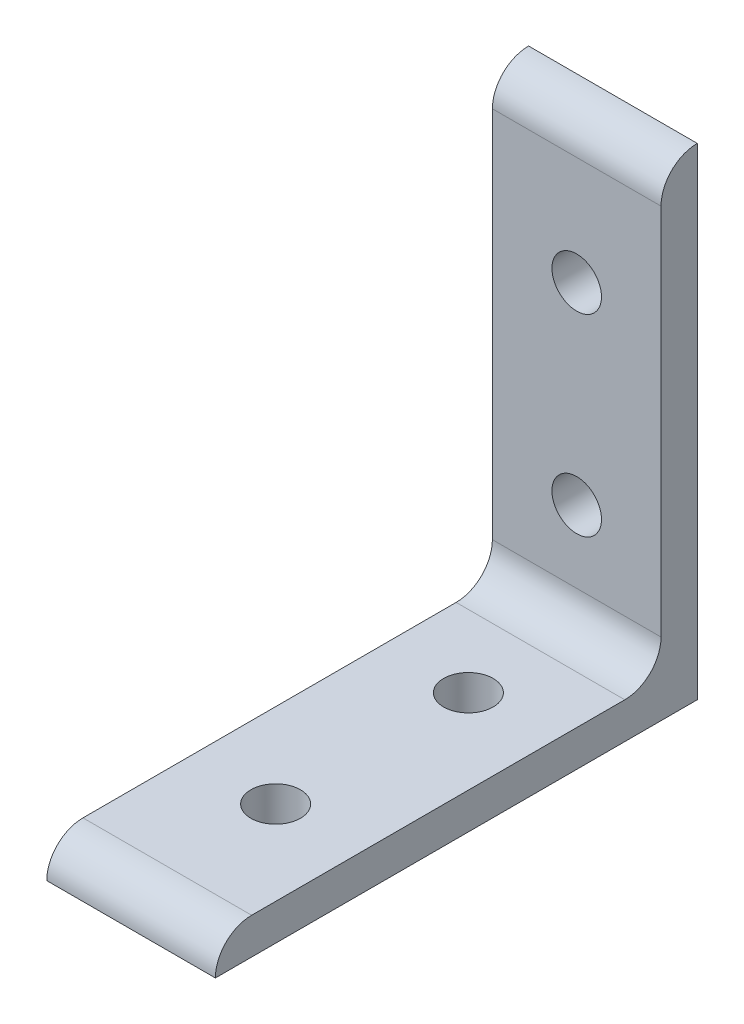
ISO-10303-21;
HEADER;
FILE_DESCRIPTION(('STEP AP214'),'2;1');
FILE_NAME('part.step','',(''),(''),'','','');
FILE_SCHEMA(('AUTOMOTIVE_DESIGN { 1 0 10303 214 1 1 1 1 }'));
ENDSEC;
DATA;
#1=APPLICATION_CONTEXT('core data for automotive mechanical design processes');
#2=APPLICATION_PROTOCOL_DEFINITION('international standard','automotive_design',2000,#1);
#3=PRODUCT_CONTEXT('',#1,'mechanical');
#4=PRODUCT('Part','Part','',(#3));
#5=PRODUCT_RELATED_PRODUCT_CATEGORY('part','',(#4));
#6=PRODUCT_DEFINITION_FORMATION('','',#4);
#7=PRODUCT_DEFINITION_CONTEXT('part definition',#1,'design');
#8=PRODUCT_DEFINITION('design','',#6,#7);
#9=PRODUCT_DEFINITION_SHAPE('','',#8);
#10=(LENGTH_UNIT() NAMED_UNIT(*) SI_UNIT(.MILLI.,.METRE.));
#11=(NAMED_UNIT(*) PLANE_ANGLE_UNIT() SI_UNIT($,.RADIAN.));
#12=(NAMED_UNIT(*) SI_UNIT($,.STERADIAN.) SOLID_ANGLE_UNIT());
#13=UNCERTAINTY_MEASURE_WITH_UNIT(LENGTH_MEASURE(1.E-05),#10,'distance_accuracy_value','');
#14=(GEOMETRIC_REPRESENTATION_CONTEXT(3) GLOBAL_UNCERTAINTY_ASSIGNED_CONTEXT((#13)) GLOBAL_UNIT_ASSIGNED_CONTEXT((#10,
#11,#12)) REPRESENTATION_CONTEXT('',''));
#15=CARTESIAN_POINT('',(0.,0.,0.));
#16=DIRECTION('',(0.,0.,1.));
#17=DIRECTION('',(1.,0.,0.));
#18=AXIS2_PLACEMENT_3D('',#15,#16,#17);
#19=CARTESIAN_POINT('',(0.,-29.6060903168951,34.7540413800445));
#20=DIRECTION('',(1.,0.,0.));
#21=DIRECTION('',(0.,0.,-1.));
#22=AXIS2_PLACEMENT_3D('',#19,#20,#21);
#23=CYLINDRICAL_SURFACE('',#22,4.7752);
#24=CARTESIAN_POINT('',(22.225,-29.6060903168951,34.7540413800445));
#25=DIRECTION('',(1.,0.,0.));
#26=DIRECTION('',(0.,0.,-1.));
#27=AXIS2_PLACEMENT_3D('',#24,#25,#26);
#28=CIRCLE('',#27,4.7752);
#29=CARTESIAN_POINT('',(22.225,-24.8308903168951,34.7540413800445));
#30=VERTEX_POINT('',#29);
#31=CARTESIAN_POINT('',(22.225,-29.6060903168951,39.5292413800445));
#32=VERTEX_POINT('',#31);
#33=EDGE_CURVE('E130',#30,#32,#28,.T.);
#34=ORIENTED_EDGE('',*,*,#33,.F.);
#35=DIRECTION('',(1.,0.,0.));
#36=VECTOR('',#35,1.);
#37=CARTESIAN_POINT('',(0.,-24.8308903168951,34.7540413800445));
#38=LINE('',#37,#36);
#39=CARTESIAN_POINT('',(0.,-24.8308903168951,34.7540413800445));
#40=VERTEX_POINT('',#39);
#41=EDGE_CURVE('E113',#40,#30,#38,.T.);
#42=ORIENTED_EDGE('',*,*,#41,.F.);
#43=CARTESIAN_POINT('',(0.,-29.6060903168951,34.7540413800445));
#44=DIRECTION('',(1.,0.,0.));
#45=DIRECTION('',(0.,0.,-1.));
#46=AXIS2_PLACEMENT_3D('',#43,#44,#45);
#47=CIRCLE('',#46,4.7752);
#48=CARTESIAN_POINT('',(0.,-29.6060903168951,39.5292413800445));
#49=VERTEX_POINT('',#48);
#50=EDGE_CURVE('E106',#40,#49,#47,.T.);
#51=ORIENTED_EDGE('',*,*,#50,.T.);
#52=DIRECTION('',(1.,0.,0.));
#53=VECTOR('',#52,1.);
#54=CARTESIAN_POINT('',(0.,-29.6060903168951,39.5292413800445));
#55=LINE('',#54,#53);
#56=EDGE_CURVE('E89',#49,#32,#55,.T.);
#57=ORIENTED_EDGE('',*,*,#56,.T.);
#58=EDGE_LOOP('',(#34,#42,#51,#57));
#59=FACE_BOUND('',#58,.T.);
#60=ADVANCED_FACE('F32',(#59),#23,.T.);
#61=CARTESIAN_POINT('',(0.,-24.8308903168951,-19.1955586199554));
#62=DIRECTION('',(0.,1.,0.));
#63=DIRECTION('',(0.,0.,1.));
#64=AXIS2_PLACEMENT_3D('',#61,#62,#63);
#65=PLANE('',#64);
#66=CARTESIAN_POINT('',(11.1125,-24.8308903168951,20.4792413800445));
#67=DIRECTION('',(0.,1.,0.));
#68=DIRECTION('',(0.,0.,1.));
#69=AXIS2_PLACEMENT_3D('',#66,#67,#68);
#70=CIRCLE('',#69,3.26390000000001);
#71=CARTESIAN_POINT('',(11.1125,-24.8308903168951,23.7431413800445));
#72=VERTEX_POINT('',#71);
#73=EDGE_CURVE('E213',#72,#72,#70,.T.);
#74=ORIENTED_EDGE('',*,*,#73,.F.);
#75=EDGE_LOOP('',(#74));
#76=FACE_BOUND('',#75,.T.);
#77=CARTESIAN_POINT('',(11.1125,-24.8308903168951,-4.92075861995548));
#78=DIRECTION('',(0.,1.,0.));
#79=DIRECTION('',(0.,0.,1.));
#80=AXIS2_PLACEMENT_3D('',#77,#78,#79);
#81=CIRCLE('',#80,3.26390000000001);
#82=CARTESIAN_POINT('',(11.1125,-24.8308903168951,-1.65685861995547));
#83=VERTEX_POINT('',#82);
#84=EDGE_CURVE('E208',#83,#83,#81,.T.);
#85=ORIENTED_EDGE('',*,*,#84,.F.);
#86=EDGE_LOOP('',(#85));
#87=FACE_BOUND('',#86,.T.);
#88=DIRECTION('',(0.,0.,1.));
#89=VECTOR('',#88,1.);
#90=CARTESIAN_POINT('',(22.225,-24.8308903168951,-19.1955586199554));
#91=LINE('',#90,#89);
#92=CARTESIAN_POINT('',(22.225,-24.8308903168951,-14.4203586199554));
#93=VERTEX_POINT('',#92);
#94=EDGE_CURVE('E114',#93,#30,#91,.T.);
#95=ORIENTED_EDGE('',*,*,#94,.F.);
#96=DIRECTION('',(1.,0.,0.));
#97=VECTOR('',#96,1.);
#98=CARTESIAN_POINT('',(0.,-24.8308903168951,-14.4203586199554));
#99=LINE('',#98,#97);
#100=CARTESIAN_POINT('',(0.,-24.8308903168951,-14.4203586199554));
#101=VERTEX_POINT('',#100);
#102=EDGE_CURVE('E47',#93,#101,#99,.F.);
#103=ORIENTED_EDGE('',*,*,#102,.T.);
#104=DIRECTION('',(0.,0.,1.));
#105=VECTOR('',#104,1.);
#106=CARTESIAN_POINT('',(0.,-24.8308903168951,-19.1955586199554));
#107=LINE('',#106,#105);
#108=EDGE_CURVE('E100',#101,#40,#107,.T.);
#109=ORIENTED_EDGE('',*,*,#108,.T.);
#110=ORIENTED_EDGE('',*,*,#41,.T.);
#111=EDGE_LOOP('',(#95,#103,#109,#110));
#112=FACE_BOUND('',#111,.T.);
#113=ADVANCED_FACE('F170',(#76,#87,#112),#65,.T.);
#114=CARTESIAN_POINT('',(0.,29.1187096831049,-19.1955586199548));
#115=DIRECTION('',(0.,0.,1.));
#116=DIRECTION('',(0.,-1.,0.));
#117=AXIS2_PLACEMENT_3D('',#114,#115,#116);
#118=PLANE('',#117);
#119=CARTESIAN_POINT('',(11.1125,14.8439096831049,-19.195558619955));
#120=DIRECTION('',(0.,0.,1.));
#121=DIRECTION('',(0.,-1.,0.));
#122=AXIS2_PLACEMENT_3D('',#119,#120,#121);
#123=CIRCLE('',#122,3.26390000000001);
#124=CARTESIAN_POINT('',(11.1125,11.5800096831049,-19.195558619955));
#125=VERTEX_POINT('',#124);
#126=EDGE_CURVE('E224',#125,#125,#123,.T.);
#127=ORIENTED_EDGE('',*,*,#126,.F.);
#128=EDGE_LOOP('',(#127));
#129=FACE_BOUND('',#128,.T.);
#130=CARTESIAN_POINT('',(11.1125,-10.5560903168951,-19.1955586199553));
#131=DIRECTION('',(0.,0.,1.));
#132=DIRECTION('',(0.,-1.,0.));
#133=AXIS2_PLACEMENT_3D('',#130,#131,#132);
#134=CIRCLE('',#133,3.26390000000001);
#135=CARTESIAN_POINT('',(11.1125,-13.8199903168951,-19.1955586199553));
#136=VERTEX_POINT('',#135);
#137=EDGE_CURVE('E119',#136,#136,#134,.T.);
#138=ORIENTED_EDGE('',*,*,#137,.F.);
#139=EDGE_LOOP('',(#138));
#140=FACE_BOUND('',#139,.T.);
#141=DIRECTION('',(0.,-1.,0.));
#142=VECTOR('',#141,1.);
#143=CARTESIAN_POINT('',(0.,29.1187096831049,-19.1955586199548));
#144=LINE('',#143,#142);
#145=CARTESIAN_POINT('',(0.,29.1187096831049,-19.1955586199548));
#146=VERTEX_POINT('',#145);
#147=CARTESIAN_POINT('',(0.,-20.055690316895,-19.1955586199554));
#148=VERTEX_POINT('',#147);
#149=EDGE_CURVE('E126',#146,#148,#144,.T.);
#150=ORIENTED_EDGE('',*,*,#149,.T.);
#151=DIRECTION('',(1.,0.,0.));
#152=VECTOR('',#151,1.);
#153=CARTESIAN_POINT('',(22.225,-20.055690316895,-19.1955586199554));
#154=LINE('',#153,#152);
#155=CARTESIAN_POINT('',(22.225,-20.055690316895,-19.1955586199554));
#156=VERTEX_POINT('',#155);
#157=EDGE_CURVE('E141',#148,#156,#154,.T.);
#158=ORIENTED_EDGE('',*,*,#157,.T.);
#159=DIRECTION('',(0.,-1.,0.));
#160=VECTOR('',#159,1.);
#161=CARTESIAN_POINT('',(22.225,29.1187096831049,-19.1955586199548));
#162=LINE('',#161,#160);
#163=CARTESIAN_POINT('',(22.225,29.1187096831049,-19.1955586199548));
#164=VERTEX_POINT('',#163);
#165=EDGE_CURVE('E116',#164,#156,#162,.T.);
#166=ORIENTED_EDGE('',*,*,#165,.F.);
#167=DIRECTION('',(1.,0.,0.));
#168=VECTOR('',#167,1.);
#169=CARTESIAN_POINT('',(0.,29.1187096831049,-19.1955586199548));
#170=LINE('',#169,#168);
#171=EDGE_CURVE('E142',#146,#164,#170,.T.);
#172=ORIENTED_EDGE('',*,*,#171,.F.);
#173=EDGE_LOOP('',(#150,#158,#166,#172));
#174=FACE_BOUND('',#173,.T.);
#175=ADVANCED_FACE('F152',(#129,#140,#174),#118,.T.);
#176=CARTESIAN_POINT('',(0.,29.1187096831049,-23.9707586199548));
#177=DIRECTION('',(1.,0.,0.));
#178=DIRECTION('',(0.,0.,-1.));
#179=AXIS2_PLACEMENT_3D('',#176,#177,#178);
#180=CYLINDRICAL_SURFACE('',#179,4.7752);
#181=CARTESIAN_POINT('',(22.225,29.1187096831049,-23.9707586199548));
#182=DIRECTION('',(1.,0.,0.));
#183=DIRECTION('',(0.,0.,-1.));
#184=AXIS2_PLACEMENT_3D('',#181,#182,#183);
#185=CIRCLE('',#184,4.7752);
#186=CARTESIAN_POINT('',(22.225,33.8939096831049,-23.9707586199548));
#187=VERTEX_POINT('',#186);
#188=EDGE_CURVE('E136',#187,#164,#185,.T.);
#189=ORIENTED_EDGE('',*,*,#188,.F.);
#190=DIRECTION('',(1.,0.,0.));
#191=VECTOR('',#190,1.);
#192=CARTESIAN_POINT('',(0.,33.8939096831049,-23.9707586199548));
#193=LINE('',#192,#191);
#194=CARTESIAN_POINT('',(0.,33.8939096831049,-23.9707586199548));
#195=VERTEX_POINT('',#194);
#196=EDGE_CURVE('E144',#195,#187,#193,.T.);
#197=ORIENTED_EDGE('',*,*,#196,.F.);
#198=CARTESIAN_POINT('',(0.,29.1187096831049,-23.9707586199548));
#199=DIRECTION('',(1.,0.,0.));
#200=DIRECTION('',(0.,0.,-1.));
#201=AXIS2_PLACEMENT_3D('',#198,#199,#200);
#202=CIRCLE('',#201,4.7752);
#203=EDGE_CURVE('E123',#195,#146,#202,.T.);
#204=ORIENTED_EDGE('',*,*,#203,.T.);
#205=ORIENTED_EDGE('',*,*,#171,.T.);
#206=EDGE_LOOP('',(#189,#197,#204,#205));
#207=FACE_BOUND('',#206,.T.);
#208=ADVANCED_FACE('F160',(#207),#180,.T.);
#209=CARTESIAN_POINT('',(0.,-29.6060903168951,-23.9707586199555));
#210=DIRECTION('',(0.,0.,-1.));
#211=DIRECTION('',(0.,1.,0.));
#212=AXIS2_PLACEMENT_3D('',#209,#210,#211);
#213=PLANE('',#212);
#214=CARTESIAN_POINT('',(11.1125,14.8439096831049,-23.970758619955));
#215=DIRECTION('',(0.,0.,-1.));
#216=DIRECTION('',(0.,1.,0.));
#217=AXIS2_PLACEMENT_3D('',#214,#215,#216);
#218=CIRCLE('',#217,3.26390000000001);
#219=CARTESIAN_POINT('',(11.1125,18.1078096831049,-23.970758619955));
#220=VERTEX_POINT('',#219);
#221=EDGE_CURVE('E215',#220,#220,#218,.T.);
#222=ORIENTED_EDGE('',*,*,#221,.F.);
#223=EDGE_LOOP('',(#222));
#224=FACE_BOUND('',#223,.T.);
#225=CARTESIAN_POINT('',(11.1125,-10.5560903168951,-23.9707586199553));
#226=DIRECTION('',(0.,0.,-1.));
#227=DIRECTION('',(0.,1.,0.));
#228=AXIS2_PLACEMENT_3D('',#225,#226,#227);
#229=CIRCLE('',#228,3.26390000000001);
#230=CARTESIAN_POINT('',(11.1125,-7.29219031689508,-23.9707586199552));
#231=VERTEX_POINT('',#230);
#232=EDGE_CURVE('E226',#231,#231,#229,.T.);
#233=ORIENTED_EDGE('',*,*,#232,.F.);
#234=EDGE_LOOP('',(#233));
#235=FACE_BOUND('',#234,.T.);
#236=DIRECTION('',(0.,1.,0.));
#237=VECTOR('',#236,1.);
#238=CARTESIAN_POINT('',(22.225,-29.6060903168951,-23.9707586199555));
#239=LINE('',#238,#237);
#240=CARTESIAN_POINT('',(22.225,-29.6060903168951,-23.9707586199555));
#241=VERTEX_POINT('',#240);
#242=EDGE_CURVE('E133',#241,#187,#239,.T.);
#243=ORIENTED_EDGE('',*,*,#242,.F.);
#244=DIRECTION('',(1.,0.,0.));
#245=VECTOR('',#244,1.);
#246=CARTESIAN_POINT('',(0.,-29.6060903168951,-23.9707586199555));
#247=LINE('',#246,#245);
#248=CARTESIAN_POINT('',(0.,-29.6060903168951,-23.9707586199555));
#249=VERTEX_POINT('',#248);
#250=EDGE_CURVE('E99',#249,#241,#247,.T.);
#251=ORIENTED_EDGE('',*,*,#250,.F.);
#252=DIRECTION('',(0.,1.,0.));
#253=VECTOR('',#252,1.);
#254=CARTESIAN_POINT('',(0.,-29.6060903168951,-23.9707586199555));
#255=LINE('',#254,#253);
#256=EDGE_CURVE('E109',#249,#195,#255,.T.);
#257=ORIENTED_EDGE('',*,*,#256,.T.);
#258=ORIENTED_EDGE('',*,*,#196,.T.);
#259=EDGE_LOOP('',(#243,#251,#257,#258));
#260=FACE_BOUND('',#259,.T.);
#261=ADVANCED_FACE('F179',(#224,#235,#260),#213,.T.);
#262=CARTESIAN_POINT('',(0.,-29.6060903168951,39.5292413800445));
#263=DIRECTION('',(0.,-1.,0.));
#264=DIRECTION('',(0.,0.,-1.));
#265=AXIS2_PLACEMENT_3D('',#262,#263,#264);
#266=PLANE('',#265);
#267=CARTESIAN_POINT('',(11.1125,-29.6060903168951,20.4792413800445));
#268=DIRECTION('',(0.,-1.,0.));
#269=DIRECTION('',(0.,0.,-1.));
#270=AXIS2_PLACEMENT_3D('',#267,#268,#269);
#271=CIRCLE('',#270,3.26390000000001);
#272=CARTESIAN_POINT('',(11.1125,-29.6060903168951,17.2153413800445));
#273=VERTEX_POINT('',#272);
#274=EDGE_CURVE('E218',#273,#273,#271,.T.);
#275=ORIENTED_EDGE('',*,*,#274,.F.);
#276=EDGE_LOOP('',(#275));
#277=FACE_BOUND('',#276,.T.);
#278=CARTESIAN_POINT('',(11.1125,-29.6060903168951,-4.92075861995548));
#279=DIRECTION('',(0.,-1.,0.));
#280=DIRECTION('',(0.,0.,-1.));
#281=AXIS2_PLACEMENT_3D('',#278,#279,#280);
#282=CIRCLE('',#281,3.26390000000001);
#283=CARTESIAN_POINT('',(11.1125,-29.6060903168951,-8.18465861995549));
#284=VERTEX_POINT('',#283);
#285=EDGE_CURVE('E211',#284,#284,#282,.T.);
#286=ORIENTED_EDGE('',*,*,#285,.F.);
#287=EDGE_LOOP('',(#286));
#288=FACE_BOUND('',#287,.T.);
#289=DIRECTION('',(0.,0.,-1.));
#290=VECTOR('',#289,1.);
#291=CARTESIAN_POINT('',(22.225,-29.6060903168951,39.5292413800445));
#292=LINE('',#291,#290);
#293=EDGE_CURVE('E94',#32,#241,#292,.T.);
#294=ORIENTED_EDGE('',*,*,#293,.F.);
#295=ORIENTED_EDGE('',*,*,#56,.F.);
#296=DIRECTION('',(0.,0.,-1.));
#297=VECTOR('',#296,1.);
#298=CARTESIAN_POINT('',(0.,-29.6060903168951,39.5292413800445));
#299=LINE('',#298,#297);
#300=EDGE_CURVE('E92',#49,#249,#299,.T.);
#301=ORIENTED_EDGE('',*,*,#300,.T.);
#302=ORIENTED_EDGE('',*,*,#250,.T.);
#303=EDGE_LOOP('',(#294,#295,#301,#302));
#304=FACE_BOUND('',#303,.T.);
#305=ADVANCED_FACE('F91',(#277,#288,#304),#266,.T.);
#306=CARTESIAN_POINT('',(0.,-29.6060903168951,34.7540413800445));
#307=DIRECTION('',(1.,0.,0.));
#308=DIRECTION('',(0.,0.,-1.));
#309=AXIS2_PLACEMENT_3D('',#306,#307,#308);
#310=PLANE('',#309);
#311=ORIENTED_EDGE('',*,*,#50,.F.);
#312=ORIENTED_EDGE('',*,*,#108,.F.);
#313=CARTESIAN_POINT('',(0.,-20.0556903168951,-14.4203586199554));
#314=DIRECTION('',(1.,0.,0.));
#315=DIRECTION('',(0.,0.,-1.));
#316=AXIS2_PLACEMENT_3D('',#313,#314,#315);
#317=CIRCLE('',#316,4.7752);
#318=EDGE_CURVE('E11',#101,#148,#317,.T.);
#319=ORIENTED_EDGE('',*,*,#318,.T.);
#320=ORIENTED_EDGE('',*,*,#149,.F.);
#321=ORIENTED_EDGE('',*,*,#203,.F.);
#322=ORIENTED_EDGE('',*,*,#256,.F.);
#323=ORIENTED_EDGE('',*,*,#300,.F.);
#324=EDGE_LOOP('',(#311,#312,#319,#320,#321,#322,#323));
#325=FACE_BOUND('',#324,.T.);
#326=ADVANCED_FACE('F105',(#325),#310,.F.);
#327=CARTESIAN_POINT('',(22.225,-29.6060903168951,34.7540413800445));
#328=DIRECTION('',(1.,0.,0.));
#329=DIRECTION('',(0.,0.,-1.));
#330=AXIS2_PLACEMENT_3D('',#327,#328,#329);
#331=PLANE('',#330);
#332=ORIENTED_EDGE('',*,*,#33,.T.);
#333=ORIENTED_EDGE('',*,*,#293,.T.);
#334=ORIENTED_EDGE('',*,*,#242,.T.);
#335=ORIENTED_EDGE('',*,*,#188,.T.);
#336=ORIENTED_EDGE('',*,*,#165,.T.);
#337=CARTESIAN_POINT('',(22.225,-20.0556903168951,-14.4203586199554));
#338=DIRECTION('',(1.,0.,0.));
#339=DIRECTION('',(0.,0.,-1.));
#340=AXIS2_PLACEMENT_3D('',#337,#338,#339);
#341=CIRCLE('',#340,4.7752);
#342=EDGE_CURVE('E40',#156,#93,#341,.F.);
#343=ORIENTED_EDGE('',*,*,#342,.T.);
#344=ORIENTED_EDGE('',*,*,#94,.T.);
#345=EDGE_LOOP('',(#332,#333,#334,#335,#336,#343,#344));
#346=FACE_BOUND('',#345,.T.);
#347=ADVANCED_FACE('F156',(#346),#331,.T.);
#348=CARTESIAN_POINT('',(11.1125,-10.5560903168951,-23.9707586199553));
#349=DIRECTION('',(0.,0.,-1.));
#350=DIRECTION('',(0.,1.,0.));
#351=AXIS2_PLACEMENT_3D('',#348,#349,#350);
#352=CYLINDRICAL_SURFACE('',#351,3.26390000000001);
#353=ORIENTED_EDGE('',*,*,#137,.T.);
#354=EDGE_LOOP('',(#353));
#355=FACE_BOUND('',#354,.T.);
#356=ORIENTED_EDGE('',*,*,#232,.T.);
#357=EDGE_LOOP('',(#356));
#358=FACE_BOUND('',#357,.T.);
#359=ADVANCED_FACE('F191',(#355,#358),#352,.F.);
#360=CARTESIAN_POINT('',(11.1125,14.8439096831049,-23.970758619955));
#361=DIRECTION('',(0.,0.,-1.));
#362=DIRECTION('',(0.,1.,0.));
#363=AXIS2_PLACEMENT_3D('',#360,#361,#362);
#364=CYLINDRICAL_SURFACE('',#363,3.26390000000001);
#365=ORIENTED_EDGE('',*,*,#126,.T.);
#366=EDGE_LOOP('',(#365));
#367=FACE_BOUND('',#366,.T.);
#368=ORIENTED_EDGE('',*,*,#221,.T.);
#369=EDGE_LOOP('',(#368));
#370=FACE_BOUND('',#369,.T.);
#371=ADVANCED_FACE('F196',(#367,#370),#364,.F.);
#372=CARTESIAN_POINT('',(11.1125,-29.6060903168951,-4.92075861995548));
#373=DIRECTION('',(0.,-1.,0.));
#374=DIRECTION('',(0.,0.,-1.));
#375=AXIS2_PLACEMENT_3D('',#372,#373,#374);
#376=CYLINDRICAL_SURFACE('',#375,3.26390000000001);
#377=ORIENTED_EDGE('',*,*,#84,.T.);
#378=EDGE_LOOP('',(#377));
#379=FACE_BOUND('',#378,.T.);
#380=ORIENTED_EDGE('',*,*,#285,.T.);
#381=EDGE_LOOP('',(#380));
#382=FACE_BOUND('',#381,.T.);
#383=ADVANCED_FACE('F166',(#379,#382),#376,.F.);
#384=CARTESIAN_POINT('',(11.1125,-29.6060903168951,20.4792413800445));
#385=DIRECTION('',(0.,-1.,0.));
#386=DIRECTION('',(0.,0.,-1.));
#387=AXIS2_PLACEMENT_3D('',#384,#385,#386);
#388=CYLINDRICAL_SURFACE('',#387,3.26390000000001);
#389=ORIENTED_EDGE('',*,*,#73,.T.);
#390=EDGE_LOOP('',(#389));
#391=FACE_BOUND('',#390,.T.);
#392=ORIENTED_EDGE('',*,*,#274,.T.);
#393=EDGE_LOOP('',(#392));
#394=FACE_BOUND('',#393,.T.);
#395=ADVANCED_FACE('F162',(#391,#394),#388,.F.);
#396=CARTESIAN_POINT('',(0.,-20.0556903168951,-14.4203586199554));
#397=DIRECTION('',(-1.,0.,0.));
#398=DIRECTION('',(0.,0.,1.));
#399=AXIS2_PLACEMENT_3D('',#396,#397,#398);
#400=CYLINDRICAL_SURFACE('',#399,4.7752);
#401=ORIENTED_EDGE('',*,*,#318,.F.);
#402=ORIENTED_EDGE('',*,*,#102,.F.);
#403=ORIENTED_EDGE('',*,*,#342,.F.);
#404=ORIENTED_EDGE('',*,*,#157,.F.);
#405=EDGE_LOOP('',(#401,#402,#403,#404));
#406=FACE_BOUND('',#405,.T.);
#407=ADVANCED_FACE('F34',(#406),#400,.F.);
#408=CLOSED_SHELL('',(#60,#113,#175,#208,#261,#305,#326,#347,#359,#371,#383,#395,#407));
#409=MANIFOLD_SOLID_BREP('B2',#408);
#410=ADVANCED_BREP_SHAPE_REPRESENTATION('',(#18,#409),#14);
#411=SHAPE_DEFINITION_REPRESENTATION(#9,#410);
ENDSEC;
END-ISO-10303-21;
